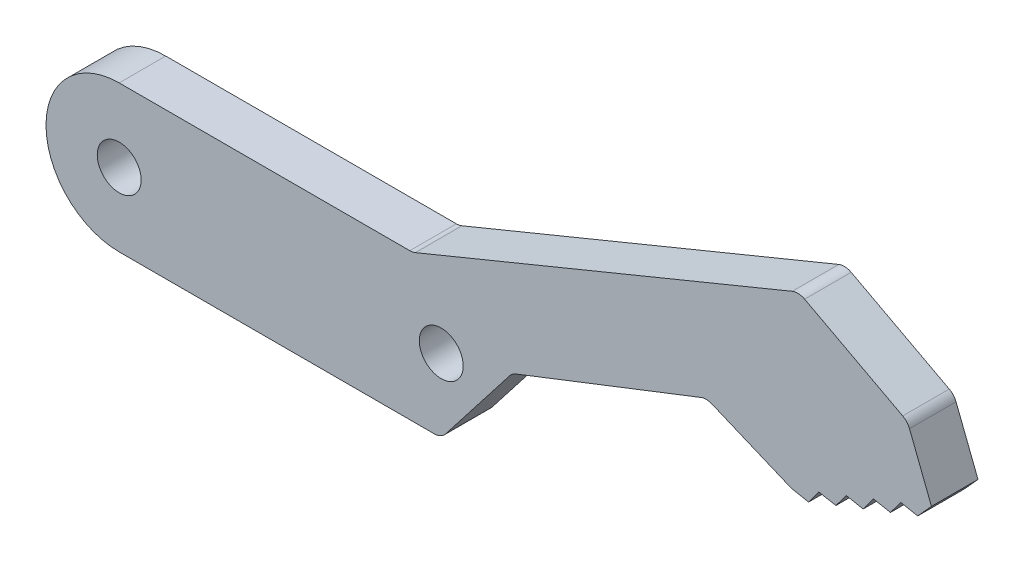
ISO-10303-21;
HEADER;
FILE_DESCRIPTION(('STEP AP214'),'2;1');
FILE_NAME('part.step','',(''),(''),'','','');
FILE_SCHEMA(('AUTOMOTIVE_DESIGN { 1 0 10303 214 1 1 1 1 }'));
ENDSEC;
DATA;
#1=APPLICATION_CONTEXT('core data for automotive mechanical design processes');
#2=APPLICATION_PROTOCOL_DEFINITION('international standard','automotive_design',2000,#1);
#3=PRODUCT_CONTEXT('',#1,'mechanical');
#4=PRODUCT('Part','Part','',(#3));
#5=PRODUCT_RELATED_PRODUCT_CATEGORY('part','',(#4));
#6=PRODUCT_DEFINITION_FORMATION('','',#4);
#7=PRODUCT_DEFINITION_CONTEXT('part definition',#1,'design');
#8=PRODUCT_DEFINITION('design','',#6,#7);
#9=PRODUCT_DEFINITION_SHAPE('','',#8);
#10=(LENGTH_UNIT() NAMED_UNIT(*) SI_UNIT(.MILLI.,.METRE.));
#11=(NAMED_UNIT(*) PLANE_ANGLE_UNIT() SI_UNIT($,.RADIAN.));
#12=(NAMED_UNIT(*) SI_UNIT($,.STERADIAN.) SOLID_ANGLE_UNIT());
#13=UNCERTAINTY_MEASURE_WITH_UNIT(LENGTH_MEASURE(1.E-05),#10,'distance_accuracy_value','');
#14=(GEOMETRIC_REPRESENTATION_CONTEXT(3) GLOBAL_UNCERTAINTY_ASSIGNED_CONTEXT((#13)) GLOBAL_UNIT_ASSIGNED_CONTEXT((#10,
#11,#12)) REPRESENTATION_CONTEXT('',''));
#15=CARTESIAN_POINT('',(0.,0.,0.));
#16=DIRECTION('',(0.,0.,1.));
#17=DIRECTION('',(1.,0.,0.));
#18=AXIS2_PLACEMENT_3D('',#15,#16,#17);
#19=CARTESIAN_POINT('',(16.1317536982652,-12.5456509983346,3.18));
#20=DIRECTION('',(0.789382298573324,-0.613901935734931,0.));
#21=DIRECTION('',(0.613901935734932,0.789382298573324,0.));
#22=AXIS2_PLACEMENT_3D('',#19,#20,#21);
#23=PLANE('',#22);
#24=DIRECTION('',(-0.613901935734932,-0.789382298573324,0.));
#25=VECTOR('',#24,1.);
#26=CARTESIAN_POINT('',(16.1317536982652,-12.5456509983346,0.));
#27=LINE('',#26,#25);
#28=CARTESIAN_POINT('',(26.6768094047843,1.01364866771164,0.));
#29=VERTEX_POINT('',#28);
#30=CARTESIAN_POINT('',(22.3002681330253,-4.61390193573488,0.));
#31=VERTEX_POINT('',#30);
#32=EDGE_CURVE('E284',#29,#31,#27,.T.);
#33=ORIENTED_EDGE('',*,*,#32,.F.);
#34=DIRECTION('',(0.,0.,-1.));
#35=VECTOR('',#34,1.);
#36=CARTESIAN_POINT('',(26.6768094047843,1.01364866771163,3.18));
#37=LINE('',#36,#35);
#38=CARTESIAN_POINT('',(26.6768094047843,1.01364866771164,3.18));
#39=VERTEX_POINT('',#38);
#40=EDGE_CURVE('E404',#29,#39,#37,.F.);
#41=ORIENTED_EDGE('',*,*,#40,.T.);
#42=DIRECTION('',(-0.613901935734932,-0.789382298573324,0.));
#43=VECTOR('',#42,1.);
#44=CARTESIAN_POINT('',(16.1317536982652,-12.5456509983346,3.18));
#45=LINE('',#44,#43);
#46=CARTESIAN_POINT('',(22.3002681330253,-4.61390193573488,3.18));
#47=VERTEX_POINT('',#46);
#48=EDGE_CURVE('E232',#39,#47,#45,.T.);
#49=ORIENTED_EDGE('',*,*,#48,.T.);
#50=DIRECTION('',(0.,0.,-1.));
#51=VECTOR('',#50,1.);
#52=CARTESIAN_POINT('',(22.3002681330253,-4.61390193573489,0.));
#53=LINE('',#52,#51);
#54=EDGE_CURVE('E401',#47,#31,#53,.T.);
#55=ORIENTED_EDGE('',*,*,#54,.T.);
#56=EDGE_LOOP('',(#33,#41,#49,#55));
#57=FACE_BOUND('',#56,.T.);
#58=ADVANCED_FACE('F32',(#57),#23,.T.);
#59=CARTESIAN_POINT('',(3.12741640444732,-8.0190164216598,3.18));
#60=DIRECTION('',(0.363345276491644,-0.931654555106779,0.));
#61=DIRECTION('',(0.931654555106779,0.363345276491644,0.));
#62=AXIS2_PLACEMENT_3D('',#59,#60,#61);
#63=PLANE('',#62);
#64=DIRECTION('',(-0.931654555106779,-0.363345276491644,0.));
#65=VECTOR('',#64,1.);
#66=CARTESIAN_POINT('',(3.12741640444732,-8.0190164216598,0.));
#67=LINE('',#66,#65);
#68=CARTESIAN_POINT('',(39.7363812023292,6.25847984951413,0.));
#69=VERTEX_POINT('',#68);
#70=CARTESIAN_POINT('',(27.102846426866,1.33140128708348,0.));
#71=VERTEX_POINT('',#70);
#72=EDGE_CURVE('E287',#69,#71,#67,.T.);
#73=ORIENTED_EDGE('',*,*,#72,.F.);
#74=DIRECTION('',(0.,0.,-1.));
#75=VECTOR('',#74,1.);
#76=CARTESIAN_POINT('',(39.7363812023292,6.25847984951412,3.18));
#77=LINE('',#76,#75);
#78=CARTESIAN_POINT('',(39.7363812023292,6.25847984951413,3.18));
#79=VERTEX_POINT('',#78);
#80=EDGE_CURVE('E399',#69,#79,#77,.F.);
#81=ORIENTED_EDGE('',*,*,#80,.T.);
#82=DIRECTION('',(-0.931654555106779,-0.363345276491644,0.));
#83=VECTOR('',#82,1.);
#84=CARTESIAN_POINT('',(3.12741640444732,-8.0190164216598,3.18));
#85=LINE('',#84,#83);
#86=CARTESIAN_POINT('',(27.102846426866,1.33140128708348,3.18));
#87=VERTEX_POINT('',#86);
#88=EDGE_CURVE('E229',#79,#87,#85,.T.);
#89=ORIENTED_EDGE('',*,*,#88,.T.);
#90=DIRECTION('',(0.,0.,-1.));
#91=VECTOR('',#90,1.);
#92=CARTESIAN_POINT('',(27.102846426866,1.33140128708348,0.));
#93=LINE('',#92,#91);
#94=EDGE_CURVE('E396',#87,#71,#93,.T.);
#95=ORIENTED_EDGE('',*,*,#94,.T.);
#96=EDGE_LOOP('',(#73,#81,#89,#95));
#97=FACE_BOUND('',#96,.T.);
#98=ADVANCED_FACE('F427',(#97),#63,.T.);
#99=CARTESIAN_POINT('',(8.25076320758145,19.7296782146172,3.18));
#100=DIRECTION('',(-0.385812916435691,-0.922577039336762,0.));
#101=DIRECTION('',(0.922577039336763,-0.385812916435691,0.));
#102=AXIS2_PLACEMENT_3D('',#99,#100,#101);
#103=PLANE('',#102);
#104=DIRECTION('',(-0.922577039336763,0.385812916435691,0.));
#105=VECTOR('',#104,1.);
#106=CARTESIAN_POINT('',(8.25076320758145,19.7296782146172,3.18));
#107=LINE('',#106,#105);
#108=CARTESIAN_POINT('',(45.938261559861,3.96912594365316,3.18));
#109=VERTEX_POINT('',#108);
#110=CARTESIAN_POINT('',(40.4855393952565,6.2494023337441,3.18));
#111=VERTEX_POINT('',#110);
#112=EDGE_CURVE('E205',#109,#111,#107,.T.);
#113=ORIENTED_EDGE('',*,*,#112,.T.);
#114=DIRECTION('',(0.,0.,-1.));
#115=VECTOR('',#114,1.);
#116=CARTESIAN_POINT('',(40.4855393952565,6.24940233374411,0.));
#117=LINE('',#116,#115);
#118=CARTESIAN_POINT('',(40.4855393952565,6.2494023337441,0.));
#119=VERTEX_POINT('',#118);
#120=EDGE_CURVE('E394',#111,#119,#117,.T.);
#121=ORIENTED_EDGE('',*,*,#120,.T.);
#122=DIRECTION('',(-0.922577039336763,0.385812916435691,0.));
#123=VECTOR('',#122,1.);
#124=CARTESIAN_POINT('',(8.25076320758145,19.7296782146172,0.));
#125=LINE('',#124,#123);
#126=CARTESIAN_POINT('',(45.938261559861,3.96912594365316,0.));
#127=VERTEX_POINT('',#126);
#128=EDGE_CURVE('E208',#127,#119,#125,.T.);
#129=ORIENTED_EDGE('',*,*,#128,.F.);
#130=DIRECTION('',(0.,0.,-1.));
#131=VECTOR('',#130,1.);
#132=CARTESIAN_POINT('',(45.938261559861,3.96912594365316,3.18));
#133=LINE('',#132,#131);
#134=EDGE_CURVE('E200',#109,#127,#133,.T.);
#135=ORIENTED_EDGE('',*,*,#134,.F.);
#136=EDGE_LOOP('',(#113,#121,#129,#135));
#137=FACE_BOUND('',#136,.T.);
#138=ADVANCED_FACE('F202',(#137),#103,.T.);
#139=CARTESIAN_POINT('',(2.30756597438727,12.2129156623156,3.18));
#140=DIRECTION('',(0.185659748422554,0.982614094044897,0.));
#141=DIRECTION('',(-0.982614094044897,0.185659748422554,0.));
#142=AXIS2_PLACEMENT_3D('',#139,#140,#141);
#143=PLANE('',#142);
#144=DIRECTION('',(0.982614094044897,-0.185659748422554,0.));
#145=VECTOR('',#144,1.);
#146=CARTESIAN_POINT('',(2.30756597438727,12.2129156623156,0.));
#147=LINE('',#146,#145);
#148=CARTESIAN_POINT('',(47.0970069127751,3.75018712320307,0.));
#149=VERTEX_POINT('',#148);
#150=EDGE_CURVE('E291',#127,#149,#147,.T.);
#151=ORIENTED_EDGE('',*,*,#150,.T.);
#152=DIRECTION('',(0.,0.,-1.));
#153=VECTOR('',#152,1.);
#154=CARTESIAN_POINT('',(47.0970069127751,3.75018712320307,3.18));
#155=LINE('',#154,#153);
#156=CARTESIAN_POINT('',(47.0970069127751,3.75018712320307,3.18));
#157=VERTEX_POINT('',#156);
#158=EDGE_CURVE('E213',#157,#149,#155,.T.);
#159=ORIENTED_EDGE('',*,*,#158,.F.);
#160=DIRECTION('',(0.982614094044897,-0.185659748422554,0.));
#161=VECTOR('',#160,1.);
#162=CARTESIAN_POINT('',(2.30756597438727,12.2129156623156,3.18));
#163=LINE('',#162,#161);
#164=EDGE_CURVE('E217',#109,#157,#163,.T.);
#165=ORIENTED_EDGE('',*,*,#164,.F.);
#166=ORIENTED_EDGE('',*,*,#134,.T.);
#167=EDGE_LOOP('',(#151,#159,#165,#166));
#168=FACE_BOUND('',#167,.T.);
#169=ADVANCED_FACE('F218',(#168),#143,.F.);
#170=CARTESIAN_POINT('',(28.4880974554059,-21.225737636109,3.18));
#171=DIRECTION('',(-0.801892104888902,0.597468871253429,0.));
#172=DIRECTION('',(-0.597468871253429,-0.801892104888902,0.));
#173=AXIS2_PLACEMENT_3D('',#170,#171,#172);
#174=PLANE('',#173);
#175=DIRECTION('',(0.597468871253429,0.801892104888902,0.));
#176=VECTOR('',#175,1.);
#177=CARTESIAN_POINT('',(28.4880974554059,-21.225737636109,0.));
#178=LINE('',#177,#176);
#179=CARTESIAN_POINT('',(47.8015706700746,4.69581649663644,0.));
#180=VERTEX_POINT('',#179);
#181=EDGE_CURVE('E293',#149,#180,#178,.T.);
#182=ORIENTED_EDGE('',*,*,#181,.T.);
#183=DIRECTION('',(0.,0.,-1.));
#184=VECTOR('',#183,1.);
#185=CARTESIAN_POINT('',(47.8015706700746,4.69581649663644,3.18));
#186=LINE('',#185,#184);
#187=CARTESIAN_POINT('',(47.8015706700746,4.69581649663644,3.18));
#188=VERTEX_POINT('',#187);
#189=EDGE_CURVE('E365',#188,#180,#186,.T.);
#190=ORIENTED_EDGE('',*,*,#189,.F.);
#191=DIRECTION('',(0.597468871253429,0.801892104888902,0.));
#192=VECTOR('',#191,1.);
#193=CARTESIAN_POINT('',(28.4880974554059,-21.225737636109,3.18));
#194=LINE('',#193,#192);
#195=EDGE_CURVE('E222',#157,#188,#194,.T.);
#196=ORIENTED_EDGE('',*,*,#195,.F.);
#197=ORIENTED_EDGE('',*,*,#158,.T.);
#198=EDGE_LOOP('',(#182,#190,#196,#197));
#199=FACE_BOUND('',#198,.T.);
#200=ADVANCED_FACE('F433',(#199),#174,.F.);
#201=CARTESIAN_POINT('',(2.50436491411768,13.2544845188675,3.18));
#202=DIRECTION('',(0.185659748422554,0.982614094044897,0.));
#203=DIRECTION('',(-0.982614094044897,0.185659748422554,0.));
#204=AXIS2_PLACEMENT_3D('',#201,#202,#203);
#205=PLANE('',#204);
#206=DIRECTION('',(0.982614094044897,-0.185659748422554,0.));
#207=VECTOR('',#206,1.);
#208=CARTESIAN_POINT('',(2.50436491411768,13.2544845188675,0.));
#209=LINE('',#208,#207);
#210=CARTESIAN_POINT('',(48.9603160229887,4.47687767618635,0.));
#211=VERTEX_POINT('',#210);
#212=EDGE_CURVE('E296',#180,#211,#209,.T.);
#213=ORIENTED_EDGE('',*,*,#212,.T.);
#214=DIRECTION('',(0.,0.,-1.));
#215=VECTOR('',#214,1.);
#216=CARTESIAN_POINT('',(48.9603160229887,4.47687767618635,3.18));
#217=LINE('',#216,#215);
#218=CARTESIAN_POINT('',(48.9603160229887,4.47687767618635,3.18));
#219=VERTEX_POINT('',#218);
#220=EDGE_CURVE('E362',#219,#211,#217,.T.);
#221=ORIENTED_EDGE('',*,*,#220,.F.);
#222=DIRECTION('',(0.982614094044897,-0.185659748422554,0.));
#223=VECTOR('',#222,1.);
#224=CARTESIAN_POINT('',(2.50436491411768,13.2544845188675,3.18));
#225=LINE('',#224,#223);
#226=EDGE_CURVE('E237',#188,#219,#225,.T.);
#227=ORIENTED_EDGE('',*,*,#226,.F.);
#228=ORIENTED_EDGE('',*,*,#189,.T.);
#229=EDGE_LOOP('',(#213,#221,#227,#228));
#230=FACE_BOUND('',#229,.T.);
#231=ADVANCED_FACE('F437',(#230),#205,.F.);
#232=CARTESIAN_POINT('',(29.3381013865813,-21.8590533730076,3.18));
#233=DIRECTION('',(-0.801892104888893,0.597468871253441,0.));
#234=DIRECTION('',(-0.597468871253441,-0.801892104888893,0.));
#235=AXIS2_PLACEMENT_3D('',#232,#233,#234);
#236=PLANE('',#235);
#237=DIRECTION('',(0.597468871253441,0.801892104888893,0.));
#238=VECTOR('',#237,1.);
#239=CARTESIAN_POINT('',(29.3381013865813,-21.8590533730076,0.));
#240=LINE('',#239,#238);
#241=CARTESIAN_POINT('',(49.6648797802882,5.42250704961975,0.));
#242=VERTEX_POINT('',#241);
#243=EDGE_CURVE('E299',#211,#242,#240,.T.);
#244=ORIENTED_EDGE('',*,*,#243,.T.);
#245=DIRECTION('',(0.,0.,-1.));
#246=VECTOR('',#245,1.);
#247=CARTESIAN_POINT('',(49.6648797802882,5.42250704961975,3.18));
#248=LINE('',#247,#246);
#249=CARTESIAN_POINT('',(49.6648797802882,5.42250704961975,3.18));
#250=VERTEX_POINT('',#249);
#251=EDGE_CURVE('E359',#250,#242,#248,.T.);
#252=ORIENTED_EDGE('',*,*,#251,.F.);
#253=DIRECTION('',(0.597468871253441,0.801892104888893,0.));
#254=VECTOR('',#253,1.);
#255=CARTESIAN_POINT('',(29.3381013865813,-21.8590533730076,3.18));
#256=LINE('',#255,#254);
#257=EDGE_CURVE('E240',#219,#250,#256,.T.);
#258=ORIENTED_EDGE('',*,*,#257,.F.);
#259=ORIENTED_EDGE('',*,*,#220,.T.);
#260=EDGE_LOOP('',(#244,#252,#258,#259));
#261=FACE_BOUND('',#260,.T.);
#262=ADVANCED_FACE('F439',(#261),#236,.F.);
#263=CARTESIAN_POINT('',(2.70116385384844,14.2960533754201,3.18));
#264=DIRECTION('',(0.185659748422568,0.982614094044895,0.));
#265=DIRECTION('',(-0.982614094044895,0.185659748422568,0.));
#266=AXIS2_PLACEMENT_3D('',#263,#264,#265);
#267=PLANE('',#266);
#268=DIRECTION('',(0.982614094044895,-0.185659748422568,0.));
#269=VECTOR('',#268,1.);
#270=CARTESIAN_POINT('',(2.70116385384844,14.2960533754201,0.));
#271=LINE('',#270,#269);
#272=CARTESIAN_POINT('',(50.8236251332022,5.20356822916965,0.));
#273=VERTEX_POINT('',#272);
#274=EDGE_CURVE('E302',#242,#273,#271,.T.);
#275=ORIENTED_EDGE('',*,*,#274,.T.);
#276=DIRECTION('',(0.,0.,-1.));
#277=VECTOR('',#276,1.);
#278=CARTESIAN_POINT('',(50.8236251332022,5.20356822916965,3.18));
#279=LINE('',#278,#277);
#280=CARTESIAN_POINT('',(50.8236251332022,5.20356822916965,3.18));
#281=VERTEX_POINT('',#280);
#282=EDGE_CURVE('E356',#281,#273,#279,.T.);
#283=ORIENTED_EDGE('',*,*,#282,.F.);
#284=DIRECTION('',(0.982614094044895,-0.185659748422568,0.));
#285=VECTOR('',#284,1.);
#286=CARTESIAN_POINT('',(2.70116385384844,14.2960533754201,3.18));
#287=LINE('',#286,#285);
#288=EDGE_CURVE('E243',#250,#281,#287,.T.);
#289=ORIENTED_EDGE('',*,*,#288,.F.);
#290=ORIENTED_EDGE('',*,*,#251,.T.);
#291=EDGE_LOOP('',(#275,#283,#289,#290));
#292=FACE_BOUND('',#291,.T.);
#293=ADVANCED_FACE('F441',(#292),#267,.F.);
#294=CARTESIAN_POINT('',(30.1881053177572,-22.4923691099061,3.18));
#295=DIRECTION('',(-0.801892104888892,0.597468871253442,0.));
#296=DIRECTION('',(-0.597468871253442,-0.801892104888892,0.));
#297=AXIS2_PLACEMENT_3D('',#294,#295,#296);
#298=PLANE('',#297);
#299=DIRECTION('',(0.597468871253442,0.801892104888892,0.));
#300=VECTOR('',#299,1.);
#301=CARTESIAN_POINT('',(30.1881053177572,-22.4923691099061,0.));
#302=LINE('',#301,#300);
#303=CARTESIAN_POINT('',(51.5281888905018,6.14919760260303,0.));
#304=VERTEX_POINT('',#303);
#305=EDGE_CURVE('E305',#273,#304,#302,.T.);
#306=ORIENTED_EDGE('',*,*,#305,.T.);
#307=DIRECTION('',(0.,0.,-1.));
#308=VECTOR('',#307,1.);
#309=CARTESIAN_POINT('',(51.5281888905018,6.14919760260303,3.18));
#310=LINE('',#309,#308);
#311=CARTESIAN_POINT('',(51.5281888905018,6.14919760260303,3.18));
#312=VERTEX_POINT('',#311);
#313=EDGE_CURVE('E353',#312,#304,#310,.T.);
#314=ORIENTED_EDGE('',*,*,#313,.F.);
#315=DIRECTION('',(0.597468871253442,0.801892104888892,0.));
#316=VECTOR('',#315,1.);
#317=CARTESIAN_POINT('',(30.1881053177572,-22.4923691099061,3.18));
#318=LINE('',#317,#316);
#319=EDGE_CURVE('E246',#281,#312,#318,.T.);
#320=ORIENTED_EDGE('',*,*,#319,.F.);
#321=ORIENTED_EDGE('',*,*,#282,.T.);
#322=EDGE_LOOP('',(#306,#314,#320,#321));
#323=FACE_BOUND('',#322,.T.);
#324=ADVANCED_FACE('F446',(#323),#298,.F.);
#325=CARTESIAN_POINT('',(2.89796279358086,15.3376222319759,3.18));
#326=DIRECTION('',(0.185659748422646,0.98261409404488,0.));
#327=DIRECTION('',(-0.98261409404488,0.185659748422646,0.));
#328=AXIS2_PLACEMENT_3D('',#325,#326,#327);
#329=PLANE('',#328);
#330=DIRECTION('',(0.98261409404488,-0.185659748422646,0.));
#331=VECTOR('',#330,1.);
#332=CARTESIAN_POINT('',(2.89796279358086,15.3376222319759,0.));
#333=LINE('',#332,#331);
#334=CARTESIAN_POINT('',(52.6869342434159,5.93025878215298,0.));
#335=VERTEX_POINT('',#334);
#336=EDGE_CURVE('E308',#304,#335,#333,.T.);
#337=ORIENTED_EDGE('',*,*,#336,.T.);
#338=DIRECTION('',(0.,0.,-1.));
#339=VECTOR('',#338,1.);
#340=CARTESIAN_POINT('',(52.6869342434159,5.93025878215298,3.18));
#341=LINE('',#340,#339);
#342=CARTESIAN_POINT('',(52.6869342434159,5.93025878215298,3.18));
#343=VERTEX_POINT('',#342);
#344=EDGE_CURVE('E350',#343,#335,#341,.T.);
#345=ORIENTED_EDGE('',*,*,#344,.F.);
#346=DIRECTION('',(0.98261409404488,-0.185659748422646,0.));
#347=VECTOR('',#346,1.);
#348=CARTESIAN_POINT('',(2.89796279358086,15.3376222319759,3.18));
#349=LINE('',#348,#347);
#350=EDGE_CURVE('E249',#312,#343,#349,.T.);
#351=ORIENTED_EDGE('',*,*,#350,.F.);
#352=ORIENTED_EDGE('',*,*,#313,.T.);
#353=EDGE_LOOP('',(#337,#345,#351,#352));
#354=FACE_BOUND('',#353,.T.);
#355=ADVANCED_FACE('F448',(#354),#329,.F.);
#356=CARTESIAN_POINT('',(31.038109248934,-23.1256848468044,3.18));
#357=DIRECTION('',(-0.801892104888899,0.597468871253432,0.));
#358=DIRECTION('',(-0.597468871253432,-0.8018921048889,0.));
#359=AXIS2_PLACEMENT_3D('',#356,#357,#358);
#360=PLANE('',#359);
#361=DIRECTION('',(0.597468871253432,0.801892104888899,0.));
#362=VECTOR('',#361,1.);
#363=CARTESIAN_POINT('',(31.038109248934,-23.1256848468044,0.));
#364=LINE('',#363,#362);
#365=CARTESIAN_POINT('',(53.3914980007154,6.87588815558636,0.));
#366=VERTEX_POINT('',#365);
#367=EDGE_CURVE('E311',#335,#366,#364,.T.);
#368=ORIENTED_EDGE('',*,*,#367,.T.);
#369=DIRECTION('',(0.,0.,-1.));
#370=VECTOR('',#369,1.);
#371=CARTESIAN_POINT('',(53.3914980007154,6.87588815558636,3.18));
#372=LINE('',#371,#370);
#373=CARTESIAN_POINT('',(53.3914980007154,6.87588815558636,3.18));
#374=VERTEX_POINT('',#373);
#375=EDGE_CURVE('E347',#374,#366,#372,.T.);
#376=ORIENTED_EDGE('',*,*,#375,.F.);
#377=DIRECTION('',(0.597468871253432,0.801892104888899,0.));
#378=VECTOR('',#377,1.);
#379=CARTESIAN_POINT('',(31.038109248934,-23.1256848468044,3.18));
#380=LINE('',#379,#378);
#381=EDGE_CURVE('E252',#343,#374,#380,.T.);
#382=ORIENTED_EDGE('',*,*,#381,.F.);
#383=ORIENTED_EDGE('',*,*,#344,.T.);
#384=EDGE_LOOP('',(#368,#376,#382,#383));
#385=FACE_BOUND('',#384,.T.);
#386=ADVANCED_FACE('F450',(#385),#360,.F.);
#387=CARTESIAN_POINT('',(3.09476173331064,16.3791910885265,3.18));
#388=DIRECTION('',(0.185659748422617,0.982614094044885,0.));
#389=DIRECTION('',(-0.982614094044885,0.185659748422617,0.));
#390=AXIS2_PLACEMENT_3D('',#387,#388,#389);
#391=PLANE('',#390);
#392=DIRECTION('',(0.982614094044885,-0.185659748422617,0.));
#393=VECTOR('',#392,1.);
#394=CARTESIAN_POINT('',(3.09476173331064,16.3791910885265,0.));
#395=LINE('',#394,#393);
#396=CARTESIAN_POINT('',(54.5502433536293,6.65694933513622,0.));
#397=VERTEX_POINT('',#396);
#398=EDGE_CURVE('E314',#366,#397,#395,.T.);
#399=ORIENTED_EDGE('',*,*,#398,.T.);
#400=DIRECTION('',(0.,0.,-1.));
#401=VECTOR('',#400,1.);
#402=CARTESIAN_POINT('',(54.5502433536293,6.65694933513622,3.18));
#403=LINE('',#402,#401);
#404=CARTESIAN_POINT('',(54.5502433536293,6.65694933513622,3.18));
#405=VERTEX_POINT('',#404);
#406=EDGE_CURVE('E344',#405,#397,#403,.T.);
#407=ORIENTED_EDGE('',*,*,#406,.F.);
#408=DIRECTION('',(0.982614094044885,-0.185659748422617,0.));
#409=VECTOR('',#408,1.);
#410=CARTESIAN_POINT('',(3.09476173331064,16.3791910885265,3.18));
#411=LINE('',#410,#409);
#412=EDGE_CURVE('E255',#374,#405,#411,.T.);
#413=ORIENTED_EDGE('',*,*,#412,.F.);
#414=ORIENTED_EDGE('',*,*,#375,.T.);
#415=EDGE_LOOP('',(#399,#407,#413,#414));
#416=FACE_BOUND('',#415,.T.);
#417=ADVANCED_FACE('F455',(#416),#391,.F.);
#418=CARTESIAN_POINT('',(26.6920416000356,-24.1428016719424,3.18));
#419=DIRECTION('',(-0.741634478368724,0.67080421919868,0.));
#420=DIRECTION('',(-0.67080421919868,-0.741634478368724,0.));
#421=AXIS2_PLACEMENT_3D('',#418,#419,#420);
#422=PLANE('',#421);
#423=DIRECTION('',(0.67080421919868,0.741634478368724,0.));
#424=VECTOR('',#423,1.);
#425=CARTESIAN_POINT('',(26.6920416000356,-24.1428016719424,0.));
#426=LINE('',#425,#424);
#427=CARTESIAN_POINT('',(55.4877207497055,7.69341502769251,0.));
#428=VERTEX_POINT('',#427);
#429=EDGE_CURVE('E317',#397,#428,#426,.T.);
#430=ORIENTED_EDGE('',*,*,#429,.T.);
#431=DIRECTION('',(0.,0.,-1.));
#432=VECTOR('',#431,1.);
#433=CARTESIAN_POINT('',(55.4877207497055,7.69341502769251,3.18));
#434=LINE('',#433,#432);
#435=CARTESIAN_POINT('',(55.4877207497055,7.69341502769251,3.18));
#436=VERTEX_POINT('',#435);
#437=EDGE_CURVE('E341',#436,#428,#434,.T.);
#438=ORIENTED_EDGE('',*,*,#437,.F.);
#439=DIRECTION('',(0.67080421919868,0.741634478368724,0.));
#440=VECTOR('',#439,1.);
#441=CARTESIAN_POINT('',(26.6920416000356,-24.1428016719424,3.18));
#442=LINE('',#441,#440);
#443=EDGE_CURVE('E258',#405,#436,#442,.T.);
#444=ORIENTED_EDGE('',*,*,#443,.F.);
#445=ORIENTED_EDGE('',*,*,#406,.T.);
#446=EDGE_LOOP('',(#430,#438,#444,#445));
#447=FACE_BOUND('',#446,.T.);
#448=ADVANCED_FACE('F457',(#447),#422,.F.);
#449=CARTESIAN_POINT('',(50.7665589883739,19.7989580054659,3.18));
#450=DIRECTION('',(0.931654555106779,0.363345276491645,0.));
#451=DIRECTION('',(-0.363345276491645,0.931654555106779,0.));
#452=AXIS2_PLACEMENT_3D('',#449,#450,#451);
#453=PLANE('',#452);
#454=DIRECTION('',(0.363345276491645,-0.931654555106779,0.));
#455=VECTOR('',#454,1.);
#456=CARTESIAN_POINT('',(50.7665589883739,19.7989580054659,0.));
#457=LINE('',#456,#455);
#458=CARTESIAN_POINT('',(53.987546600271,11.540015410858,0.));
#459=VERTEX_POINT('',#458);
#460=EDGE_CURVE('E320',#459,#428,#457,.T.);
#461=ORIENTED_EDGE('',*,*,#460,.F.);
#462=DIRECTION('',(0.,0.,-1.));
#463=VECTOR('',#462,1.);
#464=CARTESIAN_POINT('',(53.987546600271,11.540015410858,3.18));
#465=LINE('',#464,#463);
#466=CARTESIAN_POINT('',(53.987546600271,11.540015410858,3.18));
#467=VERTEX_POINT('',#466);
#468=EDGE_CURVE('E55',#459,#467,#465,.F.);
#469=ORIENTED_EDGE('',*,*,#468,.T.);
#470=DIRECTION('',(0.363345276491645,-0.931654555106779,0.));
#471=VECTOR('',#470,1.);
#472=CARTESIAN_POINT('',(50.7665589883739,19.7989580054659,3.18));
#473=LINE('',#472,#471);
#474=EDGE_CURVE('E261',#467,#436,#473,.T.);
#475=ORIENTED_EDGE('',*,*,#474,.T.);
#476=ORIENTED_EDGE('',*,*,#437,.T.);
#477=EDGE_LOOP('',(#461,#469,#475,#476));
#478=FACE_BOUND('',#477,.T.);
#479=ADVANCED_FACE('F458',(#478),#453,.T.);
#480=CARTESIAN_POINT('',(16.7628922138282,31.5759230100125,3.18));
#481=DIRECTION('',(0.468897415338877,0.883252633105908,0.));
#482=DIRECTION('',(-0.883252633105909,0.468897415338877,0.));
#483=AXIS2_PLACEMENT_3D('',#480,#481,#482);
#484=PLANE('',#483);
#485=DIRECTION('',(0.883252633105909,-0.468897415338877,0.));
#486=VECTOR('',#485,1.);
#487=CARTESIAN_POINT('',(16.7628922138282,31.5759230100125,0.));
#488=LINE('',#487,#486);
#489=CARTESIAN_POINT('',(46.8238355067757,15.6172968090969,0.));
#490=VERTEX_POINT('',#489);
#491=CARTESIAN_POINT('',(53.5247894605031,12.0599227674722,0.));
#492=VERTEX_POINT('',#491);
#493=EDGE_CURVE('E322',#490,#492,#488,.T.);
#494=ORIENTED_EDGE('',*,*,#493,.F.);
#495=DIRECTION('',(0.,0.,-1.));
#496=VECTOR('',#495,1.);
#497=CARTESIAN_POINT('',(46.8238355067757,15.6172968090969,3.18));
#498=LINE('',#497,#496);
#499=CARTESIAN_POINT('',(46.8238355067757,15.6172968090969,3.18));
#500=VERTEX_POINT('',#499);
#501=EDGE_CURVE('E385',#490,#500,#498,.F.);
#502=ORIENTED_EDGE('',*,*,#501,.T.);
#503=DIRECTION('',(0.883252633105909,-0.468897415338877,0.));
#504=VECTOR('',#503,1.);
#505=CARTESIAN_POINT('',(16.7628922138282,31.5759230100125,3.18));
#506=LINE('',#505,#504);
#507=CARTESIAN_POINT('',(53.5247894605031,12.0599227674722,3.18));
#508=VERTEX_POINT('',#507);
#509=EDGE_CURVE('E263',#500,#508,#506,.T.);
#510=ORIENTED_EDGE('',*,*,#509,.T.);
#511=DIRECTION('',(0.,0.,-1.));
#512=VECTOR('',#511,1.);
#513=CARTESIAN_POINT('',(53.5247894605031,12.0599227674722,3.18));
#514=LINE('',#513,#512);
#515=EDGE_CURVE('E382',#508,#492,#514,.T.);
#516=ORIENTED_EDGE('',*,*,#515,.T.);
#517=EDGE_LOOP('',(#494,#502,#510,#516));
#518=FACE_BOUND('',#517,.T.);
#519=ADVANCED_FACE('F465',(#518),#484,.T.);
#520=CARTESIAN_POINT('',(1.14074851739698,-2.77453321099279,3.18));
#521=DIRECTION('',(-0.380263412733205,0.924878228166549,0.));
#522=DIRECTION('',(-0.92487822816655,-0.380263412733206,0.));
#523=AXIS2_PLACEMENT_3D('',#520,#521,#522);
#524=PLANE('',#523);
#525=DIRECTION('',(0.92487822816655,0.380263412733206,0.));
#526=VECTOR('',#525,1.);
#527=CARTESIAN_POINT('',(1.14074851739698,-2.77453321099279,0.));
#528=LINE('',#527,#526);
#529=CARTESIAN_POINT('',(20.2327114807882,5.07512177183349,0.));
#530=VERTEX_POINT('',#529);
#531=CARTESIAN_POINT('',(45.9746746787036,15.6589224041576,0.));
#532=VERTEX_POINT('',#531);
#533=EDGE_CURVE('E325',#530,#532,#528,.T.);
#534=ORIENTED_EDGE('',*,*,#533,.F.);
#535=DIRECTION('',(0.,0.,-1.));
#536=VECTOR('',#535,1.);
#537=CARTESIAN_POINT('',(20.2327114807882,5.07512177183349,3.18));
#538=LINE('',#537,#536);
#539=CARTESIAN_POINT('',(20.2327114807882,5.07512177183349,3.18));
#540=VERTEX_POINT('',#539);
#541=EDGE_CURVE('E374',#530,#540,#538,.F.);
#542=ORIENTED_EDGE('',*,*,#541,.T.);
#543=DIRECTION('',(0.92487822816655,0.380263412733206,0.));
#544=VECTOR('',#543,1.);
#545=CARTESIAN_POINT('',(1.14074851739698,-2.77453321099279,3.18));
#546=LINE('',#545,#544);
#547=CARTESIAN_POINT('',(45.9746746787036,15.6589224041576,3.18));
#548=VERTEX_POINT('',#547);
#549=EDGE_CURVE('E266',#540,#548,#546,.T.);
#550=ORIENTED_EDGE('',*,*,#549,.T.);
#551=DIRECTION('',(0.,0.,-1.));
#552=VECTOR('',#551,1.);
#553=CARTESIAN_POINT('',(45.9746746787036,15.6589224041576,3.18));
#554=LINE('',#553,#552);
#555=EDGE_CURVE('E371',#548,#532,#554,.T.);
#556=ORIENTED_EDGE('',*,*,#555,.T.);
#557=EDGE_LOOP('',(#534,#542,#550,#556));
#558=FACE_BOUND('',#557,.T.);
#559=ADVANCED_FACE('F473',(#558),#524,.T.);
#560=CARTESIAN_POINT('',(0.,5.,3.18));
#561=DIRECTION('',(0.,1.,0.));
#562=DIRECTION('',(-1.,0.,0.));
#563=AXIS2_PLACEMENT_3D('',#560,#561,#562);
#564=PLANE('',#563);
#565=DIRECTION('',(1.,0.,0.));
#566=VECTOR('',#565,1.);
#567=CARTESIAN_POINT('',(0.,5.,3.18));
#568=LINE('',#567,#566);
#569=CARTESIAN_POINT('',(0.,5.,3.18));
#570=VERTEX_POINT('',#569);
#571=CARTESIAN_POINT('',(19.852448068055,5.00000000000004,3.18));
#572=VERTEX_POINT('',#571);
#573=EDGE_CURVE('E269',#570,#572,#568,.T.);
#574=ORIENTED_EDGE('',*,*,#573,.T.);
#575=DIRECTION('',(0.,0.,-1.));
#576=VECTOR('',#575,1.);
#577=CARTESIAN_POINT('',(19.852448068055,5.00000000000004,0.));
#578=LINE('',#577,#576);
#579=CARTESIAN_POINT('',(19.852448068055,5.00000000000004,0.));
#580=VERTEX_POINT('',#579);
#581=EDGE_CURVE('E212',#572,#580,#578,.T.);
#582=ORIENTED_EDGE('',*,*,#581,.T.);
#583=DIRECTION('',(1.,0.,0.));
#584=VECTOR('',#583,1.);
#585=CARTESIAN_POINT('',(0.,5.,0.));
#586=LINE('',#585,#584);
#587=CARTESIAN_POINT('',(0.,5.,0.));
#588=VERTEX_POINT('',#587);
#589=EDGE_CURVE('E328',#588,#580,#586,.T.);
#590=ORIENTED_EDGE('',*,*,#589,.F.);
#591=DIRECTION('',(0.,0.,-1.));
#592=VECTOR('',#591,1.);
#593=CARTESIAN_POINT('',(0.,5.,3.18));
#594=LINE('',#593,#592);
#595=EDGE_CURVE('E339',#570,#588,#594,.T.);
#596=ORIENTED_EDGE('',*,*,#595,.F.);
#597=EDGE_LOOP('',(#574,#582,#590,#596));
#598=FACE_BOUND('',#597,.T.);
#599=ADVANCED_FACE('F483',(#598),#564,.T.);
#600=CARTESIAN_POINT('',(0.,0.,3.18));
#601=DIRECTION('',(0.,0.,-1.));
#602=DIRECTION('',(-1.,0.,0.));
#603=AXIS2_PLACEMENT_3D('',#600,#601,#602);
#604=CYLINDRICAL_SURFACE('',#603,4.99999999999995);
#605=CARTESIAN_POINT('',(0.,0.,0.));
#606=DIRECTION('',(0.,0.,1.));
#607=DIRECTION('',(1.,0.,0.));
#608=AXIS2_PLACEMENT_3D('',#605,#606,#607);
#609=CIRCLE('',#608,4.99999999999995);
#610=CARTESIAN_POINT('',(0.,-4.99999999999991,0.));
#611=VERTEX_POINT('',#610);
#612=EDGE_CURVE('E331',#588,#611,#609,.T.);
#613=ORIENTED_EDGE('',*,*,#612,.T.);
#614=DIRECTION('',(0.,0.,-1.));
#615=VECTOR('',#614,1.);
#616=CARTESIAN_POINT('',(0.,-4.99999999999991,3.18));
#617=LINE('',#616,#615);
#618=CARTESIAN_POINT('',(0.,-4.99999999999991,3.18));
#619=VERTEX_POINT('',#618);
#620=EDGE_CURVE('E277',#619,#611,#617,.T.);
#621=ORIENTED_EDGE('',*,*,#620,.F.);
#622=CARTESIAN_POINT('',(0.,0.,3.18));
#623=DIRECTION('',(0.,0.,1.));
#624=DIRECTION('',(1.,0.,0.));
#625=AXIS2_PLACEMENT_3D('',#622,#623,#624);
#626=CIRCLE('',#625,4.99999999999995);
#627=EDGE_CURVE('E272',#570,#619,#626,.T.);
#628=ORIENTED_EDGE('',*,*,#627,.F.);
#629=ORIENTED_EDGE('',*,*,#595,.T.);
#630=EDGE_LOOP('',(#613,#621,#628,#629));
#631=FACE_BOUND('',#630,.T.);
#632=ADVANCED_FACE('F487',(#631),#604,.T.);
#633=CARTESIAN_POINT('',(22.,0.,3.18));
#634=DIRECTION('',(0.,0.,-1.));
#635=DIRECTION('',(-1.,0.,0.));
#636=AXIS2_PLACEMENT_3D('',#633,#634,#635);
#637=CYLINDRICAL_SURFACE('',#636,1.5);
#638=CARTESIAN_POINT('',(22.,0.,3.18));
#639=DIRECTION('',(0.,0.,1.));
#640=DIRECTION('',(1.,0.,0.));
#641=AXIS2_PLACEMENT_3D('',#638,#639,#640);
#642=CIRCLE('',#641,1.5);
#643=CARTESIAN_POINT('',(20.5,0.,3.18));
#644=VERTEX_POINT('',#643);
#645=EDGE_CURVE('E771',#644,#644,#642,.T.);
#646=CARTESIAN_POINT('',(22.,0.,0.));
#647=DIRECTION('',(0.,0.,1.));
#648=DIRECTION('',(1.,0.,0.));
#649=AXIS2_PLACEMENT_3D('',#646,#647,#648);
#650=CIRCLE('',#649,1.5);
#651=CARTESIAN_POINT('',(20.5,0.,0.));
#652=VERTEX_POINT('',#651);
#653=EDGE_CURVE('E281',#652,#652,#650,.T.);
#654=CARTESIAN_POINT('',(20.5,0.,3.18));
#655=CARTESIAN_POINT('',(20.5,0.,3.146875));
#656=CARTESIAN_POINT('',(20.5,0.,3.11375));
#657=CARTESIAN_POINT('',(20.5,0.,3.0475));
#658=CARTESIAN_POINT('',(20.5,0.,3.014375));
#659=CARTESIAN_POINT('',(20.5,0.,2.948125));
#660=CARTESIAN_POINT('',(20.5,0.,2.915));
#661=CARTESIAN_POINT('',(20.5,0.,2.84875));
#662=CARTESIAN_POINT('',(20.5,0.,2.815625));
#663=CARTESIAN_POINT('',(20.5,0.,2.749375));
#664=CARTESIAN_POINT('',(20.5,0.,2.71625));
#665=CARTESIAN_POINT('',(20.5,0.,2.65));
#666=CARTESIAN_POINT('',(20.5,0.,2.616875));
#667=CARTESIAN_POINT('',(20.5,0.,2.550625));
#668=CARTESIAN_POINT('',(20.5,0.,2.5175));
#669=CARTESIAN_POINT('',(20.5,0.,2.45125));
#670=CARTESIAN_POINT('',(20.5,0.,2.418125));
#671=CARTESIAN_POINT('',(20.5,0.,2.351875));
#672=CARTESIAN_POINT('',(20.5,0.,2.31875));
#673=CARTESIAN_POINT('',(20.5,0.,2.2525));
#674=CARTESIAN_POINT('',(20.5,0.,2.219375));
#675=CARTESIAN_POINT('',(20.5,0.,2.153125));
#676=CARTESIAN_POINT('',(20.5,0.,2.12));
#677=CARTESIAN_POINT('',(20.5,0.,2.05375));
#678=CARTESIAN_POINT('',(20.5,0.,2.020625));
#679=CARTESIAN_POINT('',(20.5,0.,1.954375));
#680=CARTESIAN_POINT('',(20.5,0.,1.92125));
#681=CARTESIAN_POINT('',(20.5,0.,1.855));
#682=CARTESIAN_POINT('',(20.5,0.,1.821875));
#683=CARTESIAN_POINT('',(20.5,0.,1.755625));
#684=CARTESIAN_POINT('',(20.5,0.,1.7225));
#685=CARTESIAN_POINT('',(20.5,0.,1.65625));
#686=CARTESIAN_POINT('',(20.5,0.,1.623125));
#687=CARTESIAN_POINT('',(20.5,0.,1.556875));
#688=CARTESIAN_POINT('',(20.5,0.,1.52375));
#689=CARTESIAN_POINT('',(20.5,0.,1.4575));
#690=CARTESIAN_POINT('',(20.5,0.,1.424375));
#691=CARTESIAN_POINT('',(20.5,0.,1.358125));
#692=CARTESIAN_POINT('',(20.5,0.,1.325));
#693=CARTESIAN_POINT('',(20.5,0.,1.25875));
#694=CARTESIAN_POINT('',(20.5,0.,1.225625));
#695=CARTESIAN_POINT('',(20.5,0.,1.159375));
#696=CARTESIAN_POINT('',(20.5,0.,1.12625));
#697=CARTESIAN_POINT('',(20.5,0.,1.06));
#698=CARTESIAN_POINT('',(20.5,0.,1.026875));
#699=CARTESIAN_POINT('',(20.5,0.,0.960625));
#700=CARTESIAN_POINT('',(20.5,0.,0.9275));
#701=CARTESIAN_POINT('',(20.5,0.,0.86125));
#702=CARTESIAN_POINT('',(20.5,0.,0.828125));
#703=CARTESIAN_POINT('',(20.5,0.,0.761875));
#704=CARTESIAN_POINT('',(20.5,0.,0.72875));
#705=CARTESIAN_POINT('',(20.5,0.,0.6625));
#706=CARTESIAN_POINT('',(20.5,0.,0.629375));
#707=CARTESIAN_POINT('',(20.5,0.,0.563125));
#708=CARTESIAN_POINT('',(20.5,0.,0.53));
#709=CARTESIAN_POINT('',(20.5,0.,0.46375));
#710=CARTESIAN_POINT('',(20.5,0.,0.430625));
#711=CARTESIAN_POINT('',(20.5,0.,0.364375));
#712=CARTESIAN_POINT('',(20.5,0.,0.33125));
#713=CARTESIAN_POINT('',(20.5,0.,0.265));
#714=CARTESIAN_POINT('',(20.5,0.,0.231875));
#715=CARTESIAN_POINT('',(20.5,0.,0.165625));
#716=CARTESIAN_POINT('',(20.5,0.,0.1325));
#717=CARTESIAN_POINT('',(20.5,0.,0.06625));
#718=CARTESIAN_POINT('',(20.5,0.,0.033125));
#719=CARTESIAN_POINT('',(20.5,0.,0.));
#720=B_SPLINE_CURVE_WITH_KNOTS('',3,(#654,#655,#656,#657,#658,#659,#660,#661,#662,#663,#664,
#665,#666,#667,#668,#669,#670,#671,#672,#673,#674,#675,#676,#677,#678,#679,#680,#681,#682,#683,
#684,#685,#686,#687,#688,#689,#690,#691,#692,#693,#694,#695,#696,#697,#698,#699,#700,#701,#702,
#703,#704,#705,#706,#707,#708,#709,#710,#711,#712,#713,#714,#715,#716,#717,#718,#719),
.UNSPECIFIED.,.F.,.F.,(4,2,2,2,2,2,2,2,2,2,2,2,2,2,2,2,2,2,2,2,2,2,2,2,2,2,2,2,2,2,2,2,4),(0.,
0.0993749999999996,0.19875,0.298125,0.3975,0.496875,0.59625,0.695625,0.795,0.894375,0.99375,
1.093125,1.1925,1.291875,1.39125,1.490625,1.59,1.689375,1.78875,1.888125,1.9875,2.086875,
2.18625,2.285625,2.385,2.484375,2.58375,2.683125,2.7825,2.881875,2.98125,3.080625,3.18),.UNSPECIFIED.);
#721=EDGE_CURVE('BSEAM501',#644,#652,#720,.T.);
#722=ORIENTED_EDGE('',*,*,#645,.T.);
#723=ORIENTED_EDGE('',*,*,#653,.F.);
#724=ORIENTED_EDGE('',*,*,#721,.T.);
#725=ORIENTED_EDGE('',*,*,#721,.F.);
#726=EDGE_LOOP('',(#722,#724,#723,#725));
#727=FACE_BOUND('',#726,.T.);
#728=ADVANCED_FACE('F501',(#727),#637,.F.);
#729=CARTESIAN_POINT('',(0.,0.,3.18));
#730=DIRECTION('',(0.,0.,-1.));
#731=DIRECTION('',(-1.,0.,0.));
#732=AXIS2_PLACEMENT_3D('',#729,#730,#731);
#733=CYLINDRICAL_SURFACE('',#732,1.5);
#734=CARTESIAN_POINT('',(0.,0.,3.18));
#735=DIRECTION('',(0.,0.,1.));
#736=DIRECTION('',(1.,0.,0.));
#737=AXIS2_PLACEMENT_3D('',#734,#735,#736);
#738=CIRCLE('',#737,1.5);
#739=CARTESIAN_POINT('',(-1.5,0.,3.18));
#740=VERTEX_POINT('',#739);
#741=EDGE_CURVE('E336',#740,#740,#738,.T.);
#742=CARTESIAN_POINT('',(0.,0.,0.));
#743=DIRECTION('',(0.,0.,1.));
#744=DIRECTION('',(1.,0.,0.));
#745=AXIS2_PLACEMENT_3D('',#742,#743,#744);
#746=CIRCLE('',#745,1.5);
#747=CARTESIAN_POINT('',(-1.5,0.,0.));
#748=VERTEX_POINT('',#747);
#749=EDGE_CURVE('E278',#748,#748,#746,.T.);
#750=CARTESIAN_POINT('',(-1.5,0.,3.18));
#751=CARTESIAN_POINT('',(-1.5,0.,3.146875));
#752=CARTESIAN_POINT('',(-1.5,0.,3.11375));
#753=CARTESIAN_POINT('',(-1.5,0.,3.0475));
#754=CARTESIAN_POINT('',(-1.5,0.,3.014375));
#755=CARTESIAN_POINT('',(-1.5,0.,2.948125));
#756=CARTESIAN_POINT('',(-1.5,0.,2.915));
#757=CARTESIAN_POINT('',(-1.5,0.,2.84875));
#758=CARTESIAN_POINT('',(-1.5,0.,2.815625));
#759=CARTESIAN_POINT('',(-1.5,0.,2.749375));
#760=CARTESIAN_POINT('',(-1.5,0.,2.71625));
#761=CARTESIAN_POINT('',(-1.5,0.,2.65));
#762=CARTESIAN_POINT('',(-1.5,0.,2.616875));
#763=CARTESIAN_POINT('',(-1.5,0.,2.550625));
#764=CARTESIAN_POINT('',(-1.5,0.,2.5175));
#765=CARTESIAN_POINT('',(-1.5,0.,2.45125));
#766=CARTESIAN_POINT('',(-1.5,0.,2.418125));
#767=CARTESIAN_POINT('',(-1.5,0.,2.351875));
#768=CARTESIAN_POINT('',(-1.5,0.,2.31875));
#769=CARTESIAN_POINT('',(-1.5,0.,2.2525));
#770=CARTESIAN_POINT('',(-1.5,0.,2.219375));
#771=CARTESIAN_POINT('',(-1.5,0.,2.153125));
#772=CARTESIAN_POINT('',(-1.5,0.,2.12));
#773=CARTESIAN_POINT('',(-1.5,0.,2.05375));
#774=CARTESIAN_POINT('',(-1.5,0.,2.020625));
#775=CARTESIAN_POINT('',(-1.5,0.,1.954375));
#776=CARTESIAN_POINT('',(-1.5,0.,1.92125));
#777=CARTESIAN_POINT('',(-1.5,0.,1.855));
#778=CARTESIAN_POINT('',(-1.5,0.,1.821875));
#779=CARTESIAN_POINT('',(-1.5,0.,1.755625));
#780=CARTESIAN_POINT('',(-1.5,0.,1.7225));
#781=CARTESIAN_POINT('',(-1.5,0.,1.65625));
#782=CARTESIAN_POINT('',(-1.5,0.,1.623125));
#783=CARTESIAN_POINT('',(-1.5,0.,1.556875));
#784=CARTESIAN_POINT('',(-1.5,0.,1.52375));
#785=CARTESIAN_POINT('',(-1.5,0.,1.4575));
#786=CARTESIAN_POINT('',(-1.5,0.,1.424375));
#787=CARTESIAN_POINT('',(-1.5,0.,1.358125));
#788=CARTESIAN_POINT('',(-1.5,0.,1.325));
#789=CARTESIAN_POINT('',(-1.5,0.,1.25875));
#790=CARTESIAN_POINT('',(-1.5,0.,1.225625));
#791=CARTESIAN_POINT('',(-1.5,0.,1.159375));
#792=CARTESIAN_POINT('',(-1.5,0.,1.12625));
#793=CARTESIAN_POINT('',(-1.5,0.,1.06));
#794=CARTESIAN_POINT('',(-1.5,0.,1.026875));
#795=CARTESIAN_POINT('',(-1.5,0.,0.960625));
#796=CARTESIAN_POINT('',(-1.5,0.,0.9275));
#797=CARTESIAN_POINT('',(-1.5,0.,0.86125));
#798=CARTESIAN_POINT('',(-1.5,0.,0.828125));
#799=CARTESIAN_POINT('',(-1.5,0.,0.761875));
#800=CARTESIAN_POINT('',(-1.5,0.,0.72875));
#801=CARTESIAN_POINT('',(-1.5,0.,0.6625));
#802=CARTESIAN_POINT('',(-1.5,0.,0.629375));
#803=CARTESIAN_POINT('',(-1.5,0.,0.563125));
#804=CARTESIAN_POINT('',(-1.5,0.,0.53));
#805=CARTESIAN_POINT('',(-1.5,0.,0.46375));
#806=CARTESIAN_POINT('',(-1.5,0.,0.430625));
#807=CARTESIAN_POINT('',(-1.5,0.,0.364375));
#808=CARTESIAN_POINT('',(-1.5,0.,0.33125));
#809=CARTESIAN_POINT('',(-1.5,0.,0.265));
#810=CARTESIAN_POINT('',(-1.5,0.,0.231875));
#811=CARTESIAN_POINT('',(-1.5,0.,0.165625));
#812=CARTESIAN_POINT('',(-1.5,0.,0.1325));
#813=CARTESIAN_POINT('',(-1.5,0.,0.06625));
#814=CARTESIAN_POINT('',(-1.5,0.,0.033125));
#815=CARTESIAN_POINT('',(-1.5,0.,0.));
#816=B_SPLINE_CURVE_WITH_KNOTS('',3,(#750,#751,#752,#753,#754,#755,#756,#757,#758,#759,#760,
#761,#762,#763,#764,#765,#766,#767,#768,#769,#770,#771,#772,#773,#774,#775,#776,#777,#778,#779,
#780,#781,#782,#783,#784,#785,#786,#787,#788,#789,#790,#791,#792,#793,#794,#795,#796,#797,#798,
#799,#800,#801,#802,#803,#804,#805,#806,#807,#808,#809,#810,#811,#812,#813,#814,#815),
.UNSPECIFIED.,.F.,.F.,(4,2,2,2,2,2,2,2,2,2,2,2,2,2,2,2,2,2,2,2,2,2,2,2,2,2,2,2,2,2,2,2,4),(0.,
0.0993749999999996,0.19875,0.298125,0.3975,0.496875,0.59625,0.695625,0.795,0.894375,0.99375,
1.093125,1.1925,1.291875,1.39125,1.490625,1.59,1.689375,1.78875,1.888125,1.9875,2.086875,
2.18625,2.285625,2.385,2.484375,2.58375,2.683125,2.7825,2.881875,2.98125,3.080625,3.18),.UNSPECIFIED.);
#817=EDGE_CURVE('BSEAM493',#740,#748,#816,.T.);
#818=ORIENTED_EDGE('',*,*,#741,.T.);
#819=ORIENTED_EDGE('',*,*,#749,.F.);
#820=ORIENTED_EDGE('',*,*,#817,.T.);
#821=ORIENTED_EDGE('',*,*,#817,.F.);
#822=EDGE_LOOP('',(#818,#820,#819,#821));
#823=FACE_BOUND('',#822,.T.);
#824=ADVANCED_FACE('F493',(#823),#733,.F.);
#825=CARTESIAN_POINT('',(0.,-4.99999999999991,3.18));
#826=DIRECTION('',(0.,1.,0.));
#827=DIRECTION('',(-1.,0.,0.));
#828=AXIS2_PLACEMENT_3D('',#825,#826,#827);
#829=PLANE('',#828);
#830=DIRECTION('',(1.,0.,0.));
#831=VECTOR('',#830,1.);
#832=CARTESIAN_POINT('',(0.,-4.99999999999991,0.));
#833=LINE('',#832,#831);
#834=CARTESIAN_POINT('',(21.510885834452,-4.99999999999995,0.));
#835=VERTEX_POINT('',#834);
#836=EDGE_CURVE('E334',#611,#835,#833,.T.);
#837=ORIENTED_EDGE('',*,*,#836,.T.);
#838=DIRECTION('',(0.,0.,-1.));
#839=VECTOR('',#838,1.);
#840=CARTESIAN_POINT('',(21.510885834452,-4.99999999999995,3.18));
#841=LINE('',#840,#839);
#842=CARTESIAN_POINT('',(21.510885834452,-4.99999999999995,3.18));
#843=VERTEX_POINT('',#842);
#844=EDGE_CURVE('E47',#835,#843,#841,.F.);
#845=ORIENTED_EDGE('',*,*,#844,.T.);
#846=DIRECTION('',(1.,0.,0.));
#847=VECTOR('',#846,1.);
#848=CARTESIAN_POINT('',(0.,-4.99999999999991,3.18));
#849=LINE('',#848,#847);
#850=EDGE_CURVE('E275',#619,#843,#849,.T.);
#851=ORIENTED_EDGE('',*,*,#850,.F.);
#852=ORIENTED_EDGE('',*,*,#620,.T.);
#853=EDGE_LOOP('',(#837,#845,#851,#852));
#854=FACE_BOUND('',#853,.T.);
#855=ADVANCED_FACE('F491',(#854),#829,.F.);
#856=CARTESIAN_POINT('',(0.,0.,3.18));
#857=DIRECTION('',(0.,0.,1.));
#858=DIRECTION('',(1.,0.,0.));
#859=AXIS2_PLACEMENT_3D('',#856,#857,#858);
#860=PLANE('',#859);
#861=ORIENTED_EDGE('',*,*,#741,.F.);
#862=EDGE_LOOP('',(#861));
#863=FACE_BOUND('',#862,.T.);
#864=ORIENTED_EDGE('',*,*,#645,.F.);
#865=EDGE_LOOP('',(#864));
#866=FACE_BOUND('',#865,.T.);
#867=ORIENTED_EDGE('',*,*,#509,.F.);
#868=CARTESIAN_POINT('',(46.3549380914368,14.734044175991,3.18));
#869=DIRECTION('',(0.,0.,1.));
#870=DIRECTION('',(1.,0.,0.));
#871=AXIS2_PLACEMENT_3D('',#868,#869,#870);
#872=CIRCLE('',#871,1.);
#873=EDGE_CURVE('E391',#500,#548,#872,.T.);
#874=ORIENTED_EDGE('',*,*,#873,.T.);
#875=ORIENTED_EDGE('',*,*,#549,.F.);
#876=CARTESIAN_POINT('',(19.852448068055,6.00000000000004,3.18));
#877=DIRECTION('',(0.,0.,1.));
#878=DIRECTION('',(1.,0.,0.));
#879=AXIS2_PLACEMENT_3D('',#876,#877,#878);
#880=CIRCLE('',#879,1.);
#881=EDGE_CURVE('E409',#540,#572,#880,.F.);
#882=ORIENTED_EDGE('',*,*,#881,.T.);
#883=ORIENTED_EDGE('',*,*,#573,.F.);
#884=ORIENTED_EDGE('',*,*,#627,.T.);
#885=ORIENTED_EDGE('',*,*,#850,.T.);
#886=CARTESIAN_POINT('',(21.510885834452,-3.99999999999996,3.18));
#887=DIRECTION('',(0.,0.,1.));
#888=DIRECTION('',(1.,0.,0.));
#889=AXIS2_PLACEMENT_3D('',#886,#887,#888);
#890=CIRCLE('',#889,1.);
#891=EDGE_CURVE('E387',#843,#47,#890,.T.);
#892=ORIENTED_EDGE('',*,*,#891,.T.);
#893=ORIENTED_EDGE('',*,*,#48,.F.);
#894=CARTESIAN_POINT('',(27.4661917033576,0.399746731976701,3.18));
#895=DIRECTION('',(0.,0.,1.));
#896=DIRECTION('',(1.,0.,0.));
#897=AXIS2_PLACEMENT_3D('',#894,#895,#896);
#898=CIRCLE('',#897,1.);
#899=EDGE_CURVE('E11',#39,#87,#898,.F.);
#900=ORIENTED_EDGE('',*,*,#899,.T.);
#901=ORIENTED_EDGE('',*,*,#88,.F.);
#902=CARTESIAN_POINT('',(40.0997264788208,5.32682529440734,3.18));
#903=DIRECTION('',(0.,0.,1.));
#904=DIRECTION('',(1.,0.,0.));
#905=AXIS2_PLACEMENT_3D('',#902,#903,#904);
#906=CIRCLE('',#905,1.);
#907=EDGE_CURVE('E228',#79,#111,#906,.F.);
#908=ORIENTED_EDGE('',*,*,#907,.T.);
#909=ORIENTED_EDGE('',*,*,#112,.F.);
#910=ORIENTED_EDGE('',*,*,#164,.T.);
#911=ORIENTED_EDGE('',*,*,#195,.T.);
#912=ORIENTED_EDGE('',*,*,#226,.T.);
#913=ORIENTED_EDGE('',*,*,#257,.T.);
#914=ORIENTED_EDGE('',*,*,#288,.T.);
#915=ORIENTED_EDGE('',*,*,#319,.T.);
#916=ORIENTED_EDGE('',*,*,#350,.T.);
#917=ORIENTED_EDGE('',*,*,#381,.T.);
#918=ORIENTED_EDGE('',*,*,#412,.T.);
#919=ORIENTED_EDGE('',*,*,#443,.T.);
#920=ORIENTED_EDGE('',*,*,#474,.F.);
#921=CARTESIAN_POINT('',(53.0558920451642,11.1766701343663,3.18));
#922=DIRECTION('',(0.,0.,1.));
#923=DIRECTION('',(1.,0.,0.));
#924=AXIS2_PLACEMENT_3D('',#921,#922,#923);
#925=CIRCLE('',#924,1.);
#926=EDGE_CURVE('E389',#467,#508,#925,.T.);
#927=ORIENTED_EDGE('',*,*,#926,.T.);
#928=EDGE_LOOP('',(#867,#874,#875,#882,#883,#884,#885,#892,#893,#900,#901,#908,#909,#910,#911,
#912,#913,#914,#915,#916,#917,#918,#919,#920,#927));
#929=FACE_BOUND('',#928,.T.);
#930=ADVANCED_FACE('F225',(#863,#866,#929),#860,.T.);
#931=CARTESIAN_POINT('',(0.,0.,0.));
#932=DIRECTION('',(0.,0.,1.));
#933=DIRECTION('',(1.,0.,0.));
#934=AXIS2_PLACEMENT_3D('',#931,#932,#933);
#935=PLANE('',#934);
#936=ORIENTED_EDGE('',*,*,#749,.T.);
#937=EDGE_LOOP('',(#936));
#938=FACE_BOUND('',#937,.T.);
#939=ORIENTED_EDGE('',*,*,#653,.T.);
#940=EDGE_LOOP('',(#939));
#941=FACE_BOUND('',#940,.T.);
#942=ORIENTED_EDGE('',*,*,#533,.T.);
#943=CARTESIAN_POINT('',(46.3549380914368,14.734044175991,0.));
#944=DIRECTION('',(0.,0.,1.));
#945=DIRECTION('',(1.,0.,0.));
#946=AXIS2_PLACEMENT_3D('',#943,#944,#945);
#947=CIRCLE('',#946,1.);
#948=EDGE_CURVE('E380',#532,#490,#947,.F.);
#949=ORIENTED_EDGE('',*,*,#948,.T.);
#950=ORIENTED_EDGE('',*,*,#493,.T.);
#951=CARTESIAN_POINT('',(53.0558920451642,11.1766701343663,0.));
#952=DIRECTION('',(0.,0.,1.));
#953=DIRECTION('',(1.,0.,0.));
#954=AXIS2_PLACEMENT_3D('',#951,#952,#953);
#955=CIRCLE('',#954,1.);
#956=EDGE_CURVE('E378',#492,#459,#955,.F.);
#957=ORIENTED_EDGE('',*,*,#956,.T.);
#958=ORIENTED_EDGE('',*,*,#460,.T.);
#959=ORIENTED_EDGE('',*,*,#429,.F.);
#960=ORIENTED_EDGE('',*,*,#398,.F.);
#961=ORIENTED_EDGE('',*,*,#367,.F.);
#962=ORIENTED_EDGE('',*,*,#336,.F.);
#963=ORIENTED_EDGE('',*,*,#305,.F.);
#964=ORIENTED_EDGE('',*,*,#274,.F.);
#965=ORIENTED_EDGE('',*,*,#243,.F.);
#966=ORIENTED_EDGE('',*,*,#212,.F.);
#967=ORIENTED_EDGE('',*,*,#181,.F.);
#968=ORIENTED_EDGE('',*,*,#150,.F.);
#969=ORIENTED_EDGE('',*,*,#128,.T.);
#970=CARTESIAN_POINT('',(40.0997264788208,5.32682529440734,0.));
#971=DIRECTION('',(0.,0.,1.));
#972=DIRECTION('',(1.,0.,0.));
#973=AXIS2_PLACEMENT_3D('',#970,#971,#972);
#974=CIRCLE('',#973,1.);
#975=EDGE_CURVE('E411',#119,#69,#974,.T.);
#976=ORIENTED_EDGE('',*,*,#975,.T.);
#977=ORIENTED_EDGE('',*,*,#72,.T.);
#978=CARTESIAN_POINT('',(27.4661917033576,0.399746731976701,0.));
#979=DIRECTION('',(0.,0.,1.));
#980=DIRECTION('',(1.,0.,0.));
#981=AXIS2_PLACEMENT_3D('',#978,#979,#980);
#982=CIRCLE('',#981,1.);
#983=EDGE_CURVE('E40',#71,#29,#982,.T.);
#984=ORIENTED_EDGE('',*,*,#983,.T.);
#985=ORIENTED_EDGE('',*,*,#32,.T.);
#986=CARTESIAN_POINT('',(21.510885834452,-3.99999999999996,0.));
#987=DIRECTION('',(0.,0.,1.));
#988=DIRECTION('',(1.,0.,0.));
#989=AXIS2_PLACEMENT_3D('',#986,#987,#988);
#990=CIRCLE('',#989,1.);
#991=EDGE_CURVE('E376',#31,#835,#990,.F.);
#992=ORIENTED_EDGE('',*,*,#991,.T.);
#993=ORIENTED_EDGE('',*,*,#836,.F.);
#994=ORIENTED_EDGE('',*,*,#612,.F.);
#995=ORIENTED_EDGE('',*,*,#589,.T.);
#996=CARTESIAN_POINT('',(19.852448068055,6.00000000000004,0.));
#997=DIRECTION('',(0.,0.,1.));
#998=DIRECTION('',(1.,0.,0.));
#999=AXIS2_PLACEMENT_3D('',#996,#997,#998);
#1000=CIRCLE('',#999,1.);
#1001=EDGE_CURVE('E407',#580,#530,#1000,.T.);
#1002=ORIENTED_EDGE('',*,*,#1001,.T.);
#1003=EDGE_LOOP('',(#942,#949,#950,#957,#958,#959,#960,#961,#962,#963,#964,#965,#966,#967,#968,
#969,#976,#977,#984,#985,#992,#993,#994,#995,#1002));
#1004=FACE_BOUND('',#1003,.T.);
#1005=ADVANCED_FACE('F415',(#938,#941,#1004),#935,.F.);
#1006=CARTESIAN_POINT('',(19.852448068055,6.00000000000004,3.18));
#1007=DIRECTION('',(0.,0.,1.));
#1008=DIRECTION('',(1.,0.,0.));
#1009=AXIS2_PLACEMENT_3D('',#1006,#1007,#1008);
#1010=CYLINDRICAL_SURFACE('',#1009,1.);
#1011=ORIENTED_EDGE('',*,*,#881,.F.);
#1012=ORIENTED_EDGE('',*,*,#541,.F.);
#1013=ORIENTED_EDGE('',*,*,#1001,.F.);
#1014=ORIENTED_EDGE('',*,*,#581,.F.);
#1015=EDGE_LOOP('',(#1011,#1012,#1013,#1014));
#1016=FACE_BOUND('',#1015,.T.);
#1017=ADVANCED_FACE('F480',(#1016),#1010,.F.);
#1018=CARTESIAN_POINT('',(46.3549380914368,14.734044175991,3.18));
#1019=DIRECTION('',(0.,0.,-1.));
#1020=DIRECTION('',(-1.,0.,0.));
#1021=AXIS2_PLACEMENT_3D('',#1018,#1019,#1020);
#1022=CYLINDRICAL_SURFACE('',#1021,1.);
#1023=ORIENTED_EDGE('',*,*,#873,.F.);
#1024=ORIENTED_EDGE('',*,*,#501,.F.);
#1025=ORIENTED_EDGE('',*,*,#948,.F.);
#1026=ORIENTED_EDGE('',*,*,#555,.F.);
#1027=EDGE_LOOP('',(#1023,#1024,#1025,#1026));
#1028=FACE_BOUND('',#1027,.T.);
#1029=ADVANCED_FACE('F471',(#1028),#1022,.T.);
#1030=CARTESIAN_POINT('',(53.0558920451642,11.1766701343663,3.18));
#1031=DIRECTION('',(0.,0.,-1.));
#1032=DIRECTION('',(-1.,0.,0.));
#1033=AXIS2_PLACEMENT_3D('',#1030,#1031,#1032);
#1034=CYLINDRICAL_SURFACE('',#1033,1.);
#1035=ORIENTED_EDGE('',*,*,#926,.F.);
#1036=ORIENTED_EDGE('',*,*,#468,.F.);
#1037=ORIENTED_EDGE('',*,*,#956,.F.);
#1038=ORIENTED_EDGE('',*,*,#515,.F.);
#1039=EDGE_LOOP('',(#1035,#1036,#1037,#1038));
#1040=FACE_BOUND('',#1039,.T.);
#1041=ADVANCED_FACE('F462',(#1040),#1034,.T.);
#1042=CARTESIAN_POINT('',(40.0997264788208,5.32682529440734,3.18));
#1043=DIRECTION('',(0.,0.,1.));
#1044=DIRECTION('',(1.,0.,0.));
#1045=AXIS2_PLACEMENT_3D('',#1042,#1043,#1044);
#1046=CYLINDRICAL_SURFACE('',#1045,1.);
#1047=ORIENTED_EDGE('',*,*,#907,.F.);
#1048=ORIENTED_EDGE('',*,*,#80,.F.);
#1049=ORIENTED_EDGE('',*,*,#975,.F.);
#1050=ORIENTED_EDGE('',*,*,#120,.F.);
#1051=EDGE_LOOP('',(#1047,#1048,#1049,#1050));
#1052=FACE_BOUND('',#1051,.T.);
#1053=ADVANCED_FACE('F430',(#1052),#1046,.F.);
#1054=CARTESIAN_POINT('',(27.4661917033576,0.399746731976701,3.18));
#1055=DIRECTION('',(0.,0.,1.));
#1056=DIRECTION('',(1.,0.,0.));
#1057=AXIS2_PLACEMENT_3D('',#1054,#1055,#1056);
#1058=CYLINDRICAL_SURFACE('',#1057,1.);
#1059=ORIENTED_EDGE('',*,*,#899,.F.);
#1060=ORIENTED_EDGE('',*,*,#40,.F.);
#1061=ORIENTED_EDGE('',*,*,#983,.F.);
#1062=ORIENTED_EDGE('',*,*,#94,.F.);
#1063=EDGE_LOOP('',(#1059,#1060,#1061,#1062));
#1064=FACE_BOUND('',#1063,.T.);
#1065=ADVANCED_FACE('F425',(#1064),#1058,.F.);
#1066=CARTESIAN_POINT('',(21.510885834452,-3.99999999999996,3.18));
#1067=DIRECTION('',(0.,0.,1.));
#1068=DIRECTION('',(1.,0.,0.));
#1069=AXIS2_PLACEMENT_3D('',#1066,#1067,#1068);
#1070=CYLINDRICAL_SURFACE('',#1069,1.);
#1071=ORIENTED_EDGE('',*,*,#891,.F.);
#1072=ORIENTED_EDGE('',*,*,#844,.F.);
#1073=ORIENTED_EDGE('',*,*,#991,.F.);
#1074=ORIENTED_EDGE('',*,*,#54,.F.);
#1075=EDGE_LOOP('',(#1071,#1072,#1073,#1074));
#1076=FACE_BOUND('',#1075,.T.);
#1077=ADVANCED_FACE('F34',(#1076),#1070,.T.);
#1078=CLOSED_SHELL('',(#58,#98,#138,#169,#200,#231,#262,#293,#324,#355,#386,#417,#448,#479,#519,
#559,#599,#632,#728,#824,#855,#930,#1005,#1017,#1029,#1041,#1053,#1065,#1077));
#1079=MANIFOLD_SOLID_BREP('B2',#1078);
#1080=ADVANCED_BREP_SHAPE_REPRESENTATION('',(#18,#1079),#14);
#1081=SHAPE_DEFINITION_REPRESENTATION(#9,#1080);
ENDSEC;
END-ISO-10303-21;
